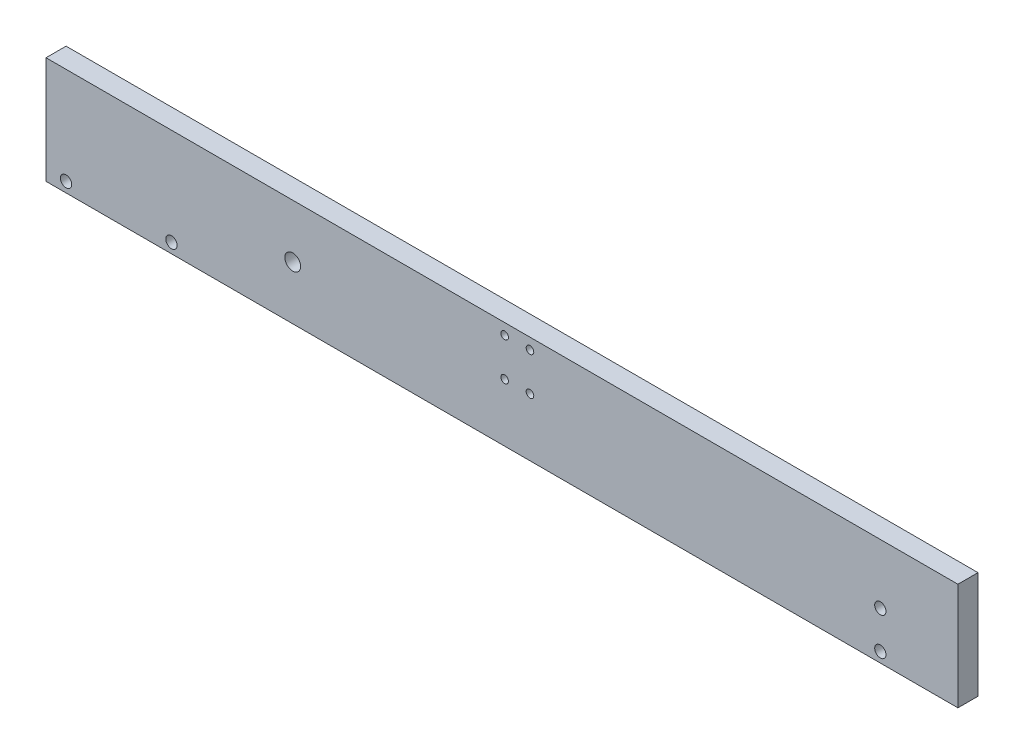
ISO-10303-21;
HEADER;
FILE_DESCRIPTION(('STEP AP214'),'2;1');
FILE_NAME('part.step','',(''),(''),'','','');
FILE_SCHEMA(('AUTOMOTIVE_DESIGN { 1 0 10303 214 1 1 1 1 }'));
ENDSEC;
DATA;
#1=APPLICATION_CONTEXT('core data for automotive mechanical design processes');
#2=APPLICATION_PROTOCOL_DEFINITION('international standard','automotive_design',2000,#1);
#3=PRODUCT_CONTEXT('',#1,'mechanical');
#4=PRODUCT('Part','Part','',(#3));
#5=PRODUCT_RELATED_PRODUCT_CATEGORY('part','',(#4));
#6=PRODUCT_DEFINITION_FORMATION('','',#4);
#7=PRODUCT_DEFINITION_CONTEXT('part definition',#1,'design');
#8=PRODUCT_DEFINITION('design','',#6,#7);
#9=PRODUCT_DEFINITION_SHAPE('','',#8);
#10=(LENGTH_UNIT() NAMED_UNIT(*) SI_UNIT(.MILLI.,.METRE.));
#11=(NAMED_UNIT(*) PLANE_ANGLE_UNIT() SI_UNIT($,.RADIAN.));
#12=(NAMED_UNIT(*) SI_UNIT($,.STERADIAN.) SOLID_ANGLE_UNIT());
#13=UNCERTAINTY_MEASURE_WITH_UNIT(LENGTH_MEASURE(1.E-05),#10,'distance_accuracy_value','');
#14=(GEOMETRIC_REPRESENTATION_CONTEXT(3) GLOBAL_UNCERTAINTY_ASSIGNED_CONTEXT((#13)) GLOBAL_UNIT_ASSIGNED_CONTEXT((#10,
#11,#12)) REPRESENTATION_CONTEXT('',''));
#15=CARTESIAN_POINT('',(0.,0.,0.));
#16=DIRECTION('',(0.,0.,1.));
#17=DIRECTION('',(1.,0.,0.));
#18=AXIS2_PLACEMENT_3D('',#15,#16,#17);
#19=CARTESIAN_POINT('',(0.,0.,6.35));
#20=DIRECTION('',(0.,0.,1.));
#21=DIRECTION('',(1.,0.,0.));
#22=AXIS2_PLACEMENT_3D('',#19,#20,#21);
#23=PLANE('',#22);
#24=CARTESIAN_POINT('',(-24.525,15.025,6.35));
#25=DIRECTION('',(0.,0.,1.));
#26=DIRECTION('',(1.,0.,0.));
#27=AXIS2_PLACEMENT_3D('',#24,#25,#26);
#28=CIRCLE('',#27,1.78593749999999);
#29=CARTESIAN_POINT('',(-22.7390625,15.025,6.35));
#30=VERTEX_POINT('',#29);
#31=EDGE_CURVE('E182',#30,#30,#28,.T.);
#32=ORIENTED_EDGE('',*,*,#31,.F.);
#33=EDGE_LOOP('',(#32));
#34=FACE_BOUND('',#33,.T.);
#35=CARTESIAN_POINT('',(-248.64,3.17500000000001,6.35));
#36=DIRECTION('',(0.,0.,1.));
#37=DIRECTION('',(1.,0.,0.));
#38=AXIS2_PLACEMENT_3D('',#35,#36,#37);
#39=CIRCLE('',#38,1.78593750000002);
#40=CARTESIAN_POINT('',(-246.8540625,3.17500000000001,6.35));
#41=VERTEX_POINT('',#40);
#42=EDGE_CURVE('E166',#41,#41,#39,.T.);
#43=ORIENTED_EDGE('',*,*,#42,.F.);
#44=EDGE_LOOP('',(#43));
#45=FACE_BOUND('',#44,.T.);
#46=CARTESIAN_POINT('',(-143.29,18.35,6.35));
#47=DIRECTION('',(0.,0.,1.));
#48=DIRECTION('',(1.,0.,0.));
#49=AXIS2_PLACEMENT_3D('',#46,#47,#48);
#50=CIRCLE('',#49,1.20000000000004);
#51=CARTESIAN_POINT('',(-142.09,18.35,6.35));
#52=VERTEX_POINT('',#51);
#53=EDGE_CURVE('E150',#52,#52,#50,.T.);
#54=ORIENTED_EDGE('',*,*,#53,.F.);
#55=EDGE_LOOP('',(#54));
#56=FACE_BOUND('',#55,.T.);
#57=CARTESIAN_POINT('',(-135.29,18.35,6.35));
#58=DIRECTION('',(0.,0.,1.));
#59=DIRECTION('',(1.,0.,0.));
#60=AXIS2_PLACEMENT_3D('',#57,#58,#59);
#61=CIRCLE('',#60,1.20000000000002);
#62=CARTESIAN_POINT('',(-134.09,18.35,6.35));
#63=VERTEX_POINT('',#62);
#64=EDGE_CURVE('E134',#63,#63,#61,.T.);
#65=ORIENTED_EDGE('',*,*,#64,.F.);
#66=EDGE_LOOP('',(#65));
#67=FACE_BOUND('',#66,.T.);
#68=DIRECTION('',(0.,1.,0.));
#69=VECTOR('',#68,1.);
#70=CARTESIAN_POINT('',(0.,0.,6.35));
#71=LINE('',#70,#69);
#72=CARTESIAN_POINT('',(0.,0.,6.35));
#73=VERTEX_POINT('',#72);
#74=CARTESIAN_POINT('',(0.,33.85,6.35));
#75=VERTEX_POINT('',#74);
#76=EDGE_CURVE('E92',#73,#75,#71,.T.);
#77=ORIENTED_EDGE('',*,*,#76,.T.);
#78=DIRECTION('',(-1.,0.,0.));
#79=VECTOR('',#78,1.);
#80=CARTESIAN_POINT('',(0.,33.85,6.35));
#81=LINE('',#80,#79);
#82=CARTESIAN_POINT('',(-288.29,33.85,6.35));
#83=VERTEX_POINT('',#82);
#84=EDGE_CURVE('E87',#75,#83,#81,.T.);
#85=ORIENTED_EDGE('',*,*,#84,.T.);
#86=DIRECTION('',(0.,-1.,0.));
#87=VECTOR('',#86,1.);
#88=CARTESIAN_POINT('',(-288.29,33.85,6.35));
#89=LINE('',#88,#87);
#90=CARTESIAN_POINT('',(-288.29,0.,6.35));
#91=VERTEX_POINT('',#90);
#92=EDGE_CURVE('E90',#83,#91,#89,.T.);
#93=ORIENTED_EDGE('',*,*,#92,.T.);
#94=DIRECTION('',(1.,0.,0.));
#95=VECTOR('',#94,1.);
#96=CARTESIAN_POINT('',(0.,0.,6.35));
#97=LINE('',#96,#95);
#98=EDGE_CURVE('E57',#91,#73,#97,.T.);
#99=ORIENTED_EDGE('',*,*,#98,.T.);
#100=EDGE_LOOP('',(#77,#85,#93,#99));
#101=FACE_BOUND('',#100,.T.);
#102=CARTESIAN_POINT('',(-210.29,16.925,6.35));
#103=DIRECTION('',(0.,0.,1.));
#104=DIRECTION('',(1.,0.,0.));
#105=AXIS2_PLACEMENT_3D('',#102,#103,#104);
#106=CIRCLE('',#105,2.49999999999999);
#107=CARTESIAN_POINT('',(-207.79,16.925,6.35));
#108=VERTEX_POINT('',#107);
#109=EDGE_CURVE('E112',#108,#108,#106,.T.);
#110=ORIENTED_EDGE('',*,*,#109,.F.);
#111=EDGE_LOOP('',(#110));
#112=FACE_BOUND('',#111,.T.);
#113=CARTESIAN_POINT('',(-135.29,30.35,6.35));
#114=DIRECTION('',(0.,0.,1.));
#115=DIRECTION('',(1.,0.,0.));
#116=AXIS2_PLACEMENT_3D('',#113,#114,#115);
#117=CIRCLE('',#116,1.20000000000002);
#118=CARTESIAN_POINT('',(-134.09,30.35,6.35));
#119=VERTEX_POINT('',#118);
#120=EDGE_CURVE('E142',#119,#119,#117,.T.);
#121=ORIENTED_EDGE('',*,*,#120,.F.);
#122=EDGE_LOOP('',(#121));
#123=FACE_BOUND('',#122,.T.);
#124=CARTESIAN_POINT('',(-143.29,30.35,6.35));
#125=DIRECTION('',(0.,0.,1.));
#126=DIRECTION('',(1.,0.,0.));
#127=AXIS2_PLACEMENT_3D('',#124,#125,#126);
#128=CIRCLE('',#127,1.20000000000004);
#129=CARTESIAN_POINT('',(-142.09,30.35,6.35));
#130=VERTEX_POINT('',#129);
#131=EDGE_CURVE('E158',#130,#130,#128,.T.);
#132=ORIENTED_EDGE('',*,*,#131,.F.);
#133=EDGE_LOOP('',(#132));
#134=FACE_BOUND('',#133,.T.);
#135=CARTESIAN_POINT('',(-281.94,3.17500000000001,6.35));
#136=DIRECTION('',(0.,0.,1.));
#137=DIRECTION('',(1.,0.,0.));
#138=AXIS2_PLACEMENT_3D('',#135,#136,#137);
#139=CIRCLE('',#138,1.78593749999999);
#140=CARTESIAN_POINT('',(-280.1540625,3.17500000000001,6.35));
#141=VERTEX_POINT('',#140);
#142=EDGE_CURVE('E174',#141,#141,#139,.T.);
#143=ORIENTED_EDGE('',*,*,#142,.F.);
#144=EDGE_LOOP('',(#143));
#145=FACE_BOUND('',#144,.T.);
#146=CARTESIAN_POINT('',(-24.525,3.17499999999999,6.35));
#147=DIRECTION('',(0.,0.,1.));
#148=DIRECTION('',(1.,0.,0.));
#149=AXIS2_PLACEMENT_3D('',#146,#147,#148);
#150=CIRCLE('',#149,1.78593749999999);
#151=CARTESIAN_POINT('',(-22.7390625,3.17499999999999,6.35));
#152=VERTEX_POINT('',#151);
#153=EDGE_CURVE('E190',#152,#152,#150,.T.);
#154=ORIENTED_EDGE('',*,*,#153,.F.);
#155=EDGE_LOOP('',(#154));
#156=FACE_BOUND('',#155,.T.);
#157=ADVANCED_FACE('F39',(#34,#45,#56,#67,#101,#112,#123,#134,#145,#156),#23,.T.);
#158=CARTESIAN_POINT('',(0.,0.,0.));
#159=DIRECTION('',(0.,0.,1.));
#160=DIRECTION('',(1.,0.,0.));
#161=AXIS2_PLACEMENT_3D('',#158,#159,#160);
#162=PLANE('',#161);
#163=DIRECTION('',(0.,1.,0.));
#164=VECTOR('',#163,1.);
#165=CARTESIAN_POINT('',(0.,0.,0.));
#166=LINE('',#165,#164);
#167=CARTESIAN_POINT('',(0.,0.,0.));
#168=VERTEX_POINT('',#167);
#169=CARTESIAN_POINT('',(0.,33.85,0.));
#170=VERTEX_POINT('',#169);
#171=EDGE_CURVE('E108',#168,#170,#166,.T.);
#172=ORIENTED_EDGE('',*,*,#171,.F.);
#173=DIRECTION('',(1.,0.,0.));
#174=VECTOR('',#173,1.);
#175=CARTESIAN_POINT('',(0.,0.,0.));
#176=LINE('',#175,#174);
#177=CARTESIAN_POINT('',(-288.29,0.,0.));
#178=VERTEX_POINT('',#177);
#179=EDGE_CURVE('E80',#178,#168,#176,.T.);
#180=ORIENTED_EDGE('',*,*,#179,.F.);
#181=DIRECTION('',(0.,-1.,0.));
#182=VECTOR('',#181,1.);
#183=CARTESIAN_POINT('',(-288.29,33.85,0.));
#184=LINE('',#183,#182);
#185=CARTESIAN_POINT('',(-288.29,33.85,0.));
#186=VERTEX_POINT('',#185);
#187=EDGE_CURVE('E74',#186,#178,#184,.T.);
#188=ORIENTED_EDGE('',*,*,#187,.F.);
#189=DIRECTION('',(-1.,0.,0.));
#190=VECTOR('',#189,1.);
#191=CARTESIAN_POINT('',(0.,33.85,0.));
#192=LINE('',#191,#190);
#193=EDGE_CURVE('E97',#170,#186,#192,.T.);
#194=ORIENTED_EDGE('',*,*,#193,.F.);
#195=EDGE_LOOP('',(#172,#180,#188,#194));
#196=FACE_BOUND('',#195,.T.);
#197=CARTESIAN_POINT('',(-210.29,16.925,0.));
#198=DIRECTION('',(0.,0.,1.));
#199=DIRECTION('',(1.,0.,0.));
#200=AXIS2_PLACEMENT_3D('',#197,#198,#199);
#201=CIRCLE('',#200,2.49999999999999);
#202=CARTESIAN_POINT('',(-207.79,16.925,0.));
#203=VERTEX_POINT('',#202);
#204=EDGE_CURVE('E130',#203,#203,#201,.T.);
#205=ORIENTED_EDGE('',*,*,#204,.T.);
#206=EDGE_LOOP('',(#205));
#207=FACE_BOUND('',#206,.T.);
#208=CARTESIAN_POINT('',(-135.29,18.35,0.));
#209=DIRECTION('',(0.,0.,1.));
#210=DIRECTION('',(1.,0.,0.));
#211=AXIS2_PLACEMENT_3D('',#208,#209,#210);
#212=CIRCLE('',#211,1.20000000000002);
#213=CARTESIAN_POINT('',(-134.09,18.35,0.));
#214=VERTEX_POINT('',#213);
#215=EDGE_CURVE('E138',#214,#214,#212,.T.);
#216=ORIENTED_EDGE('',*,*,#215,.T.);
#217=EDGE_LOOP('',(#216));
#218=FACE_BOUND('',#217,.T.);
#219=CARTESIAN_POINT('',(-135.29,30.35,0.));
#220=DIRECTION('',(0.,0.,1.));
#221=DIRECTION('',(1.,0.,0.));
#222=AXIS2_PLACEMENT_3D('',#219,#220,#221);
#223=CIRCLE('',#222,1.20000000000002);
#224=CARTESIAN_POINT('',(-134.09,30.35,0.));
#225=VERTEX_POINT('',#224);
#226=EDGE_CURVE('E146',#225,#225,#223,.T.);
#227=ORIENTED_EDGE('',*,*,#226,.T.);
#228=EDGE_LOOP('',(#227));
#229=FACE_BOUND('',#228,.T.);
#230=CARTESIAN_POINT('',(-143.29,18.35,0.));
#231=DIRECTION('',(0.,0.,1.));
#232=DIRECTION('',(1.,0.,0.));
#233=AXIS2_PLACEMENT_3D('',#230,#231,#232);
#234=CIRCLE('',#233,1.20000000000004);
#235=CARTESIAN_POINT('',(-142.09,18.35,0.));
#236=VERTEX_POINT('',#235);
#237=EDGE_CURVE('E154',#236,#236,#234,.T.);
#238=ORIENTED_EDGE('',*,*,#237,.T.);
#239=EDGE_LOOP('',(#238));
#240=FACE_BOUND('',#239,.T.);
#241=CARTESIAN_POINT('',(-143.29,30.35,0.));
#242=DIRECTION('',(0.,0.,1.));
#243=DIRECTION('',(1.,0.,0.));
#244=AXIS2_PLACEMENT_3D('',#241,#242,#243);
#245=CIRCLE('',#244,1.20000000000004);
#246=CARTESIAN_POINT('',(-142.09,30.35,0.));
#247=VERTEX_POINT('',#246);
#248=EDGE_CURVE('E162',#247,#247,#245,.T.);
#249=ORIENTED_EDGE('',*,*,#248,.T.);
#250=EDGE_LOOP('',(#249));
#251=FACE_BOUND('',#250,.T.);
#252=CARTESIAN_POINT('',(-248.64,3.17500000000001,0.));
#253=DIRECTION('',(0.,0.,1.));
#254=DIRECTION('',(1.,0.,0.));
#255=AXIS2_PLACEMENT_3D('',#252,#253,#254);
#256=CIRCLE('',#255,1.78593750000002);
#257=CARTESIAN_POINT('',(-246.8540625,3.17500000000001,0.));
#258=VERTEX_POINT('',#257);
#259=EDGE_CURVE('E170',#258,#258,#256,.T.);
#260=ORIENTED_EDGE('',*,*,#259,.T.);
#261=EDGE_LOOP('',(#260));
#262=FACE_BOUND('',#261,.T.);
#263=CARTESIAN_POINT('',(-281.94,3.17500000000001,0.));
#264=DIRECTION('',(0.,0.,1.));
#265=DIRECTION('',(1.,0.,0.));
#266=AXIS2_PLACEMENT_3D('',#263,#264,#265);
#267=CIRCLE('',#266,1.78593749999999);
#268=CARTESIAN_POINT('',(-280.1540625,3.17500000000001,0.));
#269=VERTEX_POINT('',#268);
#270=EDGE_CURVE('E178',#269,#269,#267,.T.);
#271=ORIENTED_EDGE('',*,*,#270,.T.);
#272=EDGE_LOOP('',(#271));
#273=FACE_BOUND('',#272,.T.);
#274=CARTESIAN_POINT('',(-24.525,15.025,0.));
#275=DIRECTION('',(0.,0.,1.));
#276=DIRECTION('',(1.,0.,0.));
#277=AXIS2_PLACEMENT_3D('',#274,#275,#276);
#278=CIRCLE('',#277,1.78593749999999);
#279=CARTESIAN_POINT('',(-22.7390625,15.025,0.));
#280=VERTEX_POINT('',#279);
#281=EDGE_CURVE('E186',#280,#280,#278,.T.);
#282=ORIENTED_EDGE('',*,*,#281,.T.);
#283=EDGE_LOOP('',(#282));
#284=FACE_BOUND('',#283,.T.);
#285=CARTESIAN_POINT('',(-24.525,3.17499999999999,0.));
#286=DIRECTION('',(0.,0.,1.));
#287=DIRECTION('',(1.,0.,0.));
#288=AXIS2_PLACEMENT_3D('',#285,#286,#287);
#289=CIRCLE('',#288,1.78593749999999);
#290=CARTESIAN_POINT('',(-22.7390625,3.17499999999999,0.));
#291=VERTEX_POINT('',#290);
#292=EDGE_CURVE('E194',#291,#291,#289,.T.);
#293=ORIENTED_EDGE('',*,*,#292,.T.);
#294=EDGE_LOOP('',(#293));
#295=FACE_BOUND('',#294,.T.);
#296=ADVANCED_FACE('F125',(#196,#207,#218,#229,#240,#251,#262,#273,#284,#295),#162,.F.);
#297=CARTESIAN_POINT('',(0.,0.,6.35));
#298=DIRECTION('',(-1.,0.,0.));
#299=DIRECTION('',(0.,0.,1.));
#300=AXIS2_PLACEMENT_3D('',#297,#298,#299);
#301=PLANE('',#300);
#302=ORIENTED_EDGE('',*,*,#171,.T.);
#303=DIRECTION('',(0.,0.,-1.));
#304=VECTOR('',#303,1.);
#305=CARTESIAN_POINT('',(0.,33.85,6.35));
#306=LINE('',#305,#304);
#307=EDGE_CURVE('E11',#75,#170,#306,.T.);
#308=ORIENTED_EDGE('',*,*,#307,.F.);
#309=ORIENTED_EDGE('',*,*,#76,.F.);
#310=DIRECTION('',(0.,0.,-1.));
#311=VECTOR('',#310,1.);
#312=CARTESIAN_POINT('',(0.,0.,6.35));
#313=LINE('',#312,#311);
#314=EDGE_CURVE('E104',#73,#168,#313,.T.);
#315=ORIENTED_EDGE('',*,*,#314,.T.);
#316=EDGE_LOOP('',(#302,#308,#309,#315));
#317=FACE_BOUND('',#316,.T.);
#318=ADVANCED_FACE('F41',(#317),#301,.F.);
#319=CARTESIAN_POINT('',(0.,33.85,6.35));
#320=DIRECTION('',(0.,-1.,0.));
#321=DIRECTION('',(0.,0.,-1.));
#322=AXIS2_PLACEMENT_3D('',#319,#320,#321);
#323=PLANE('',#322);
#324=ORIENTED_EDGE('',*,*,#193,.T.);
#325=DIRECTION('',(0.,0.,-1.));
#326=VECTOR('',#325,1.);
#327=CARTESIAN_POINT('',(-288.29,33.85,6.35));
#328=LINE('',#327,#326);
#329=EDGE_CURVE('E49',#83,#186,#328,.T.);
#330=ORIENTED_EDGE('',*,*,#329,.F.);
#331=ORIENTED_EDGE('',*,*,#84,.F.);
#332=ORIENTED_EDGE('',*,*,#307,.T.);
#333=EDGE_LOOP('',(#324,#330,#331,#332));
#334=FACE_BOUND('',#333,.T.);
#335=ADVANCED_FACE('F96',(#334),#323,.F.);
#336=CARTESIAN_POINT('',(-288.29,33.85,6.35));
#337=DIRECTION('',(1.,0.,0.));
#338=DIRECTION('',(0.,0.,-1.));
#339=AXIS2_PLACEMENT_3D('',#336,#337,#338);
#340=PLANE('',#339);
#341=ORIENTED_EDGE('',*,*,#187,.T.);
#342=DIRECTION('',(0.,0.,-1.));
#343=VECTOR('',#342,1.);
#344=CARTESIAN_POINT('',(-288.29,0.,6.35));
#345=LINE('',#344,#343);
#346=EDGE_CURVE('E99',#91,#178,#345,.T.);
#347=ORIENTED_EDGE('',*,*,#346,.F.);
#348=ORIENTED_EDGE('',*,*,#92,.F.);
#349=ORIENTED_EDGE('',*,*,#329,.T.);
#350=EDGE_LOOP('',(#341,#347,#348,#349));
#351=FACE_BOUND('',#350,.T.);
#352=ADVANCED_FACE('F100',(#351),#340,.F.);
#353=CARTESIAN_POINT('',(0.,0.,6.35));
#354=DIRECTION('',(0.,1.,0.));
#355=DIRECTION('',(-1.,0.,0.));
#356=AXIS2_PLACEMENT_3D('',#353,#354,#355);
#357=PLANE('',#356);
#358=ORIENTED_EDGE('',*,*,#179,.T.);
#359=ORIENTED_EDGE('',*,*,#314,.F.);
#360=ORIENTED_EDGE('',*,*,#98,.F.);
#361=ORIENTED_EDGE('',*,*,#346,.T.);
#362=EDGE_LOOP('',(#358,#359,#360,#361));
#363=FACE_BOUND('',#362,.T.);
#364=ADVANCED_FACE('F122',(#363),#357,.F.);
#365=CARTESIAN_POINT('',(-210.29,16.925,6.35));
#366=DIRECTION('',(0.,0.,-1.));
#367=DIRECTION('',(-1.,0.,0.));
#368=AXIS2_PLACEMENT_3D('',#365,#366,#367);
#369=CYLINDRICAL_SURFACE('',#368,2.49999999999999);
#370=ORIENTED_EDGE('',*,*,#109,.T.);
#371=EDGE_LOOP('',(#370));
#372=FACE_BOUND('',#371,.T.);
#373=ORIENTED_EDGE('',*,*,#204,.F.);
#374=EDGE_LOOP('',(#373));
#375=FACE_BOUND('',#374,.T.);
#376=ADVANCED_FACE('F215',(#372,#375),#369,.F.);
#377=CARTESIAN_POINT('',(-135.29,18.35,6.35));
#378=DIRECTION('',(0.,0.,-1.));
#379=DIRECTION('',(-1.,0.,0.));
#380=AXIS2_PLACEMENT_3D('',#377,#378,#379);
#381=CYLINDRICAL_SURFACE('',#380,1.20000000000002);
#382=ORIENTED_EDGE('',*,*,#64,.T.);
#383=EDGE_LOOP('',(#382));
#384=FACE_BOUND('',#383,.T.);
#385=ORIENTED_EDGE('',*,*,#215,.F.);
#386=EDGE_LOOP('',(#385));
#387=FACE_BOUND('',#386,.T.);
#388=ADVANCED_FACE('F261',(#384,#387),#381,.F.);
#389=CARTESIAN_POINT('',(-135.29,30.35,6.35));
#390=DIRECTION('',(0.,0.,-1.));
#391=DIRECTION('',(-1.,0.,0.));
#392=AXIS2_PLACEMENT_3D('',#389,#390,#391);
#393=CYLINDRICAL_SURFACE('',#392,1.20000000000002);
#394=ORIENTED_EDGE('',*,*,#120,.T.);
#395=EDGE_LOOP('',(#394));
#396=FACE_BOUND('',#395,.T.);
#397=ORIENTED_EDGE('',*,*,#226,.F.);
#398=EDGE_LOOP('',(#397));
#399=FACE_BOUND('',#398,.T.);
#400=ADVANCED_FACE('F269',(#396,#399),#393,.F.);
#401=CARTESIAN_POINT('',(-143.29,18.35,6.35));
#402=DIRECTION('',(0.,0.,-1.));
#403=DIRECTION('',(-1.,0.,0.));
#404=AXIS2_PLACEMENT_3D('',#401,#402,#403);
#405=CYLINDRICAL_SURFACE('',#404,1.20000000000004);
#406=ORIENTED_EDGE('',*,*,#53,.T.);
#407=EDGE_LOOP('',(#406));
#408=FACE_BOUND('',#407,.T.);
#409=ORIENTED_EDGE('',*,*,#237,.F.);
#410=EDGE_LOOP('',(#409));
#411=FACE_BOUND('',#410,.T.);
#412=ADVANCED_FACE('F277',(#408,#411),#405,.F.);
#413=CARTESIAN_POINT('',(-143.29,30.35,6.35));
#414=DIRECTION('',(0.,0.,-1.));
#415=DIRECTION('',(-1.,0.,0.));
#416=AXIS2_PLACEMENT_3D('',#413,#414,#415);
#417=CYLINDRICAL_SURFACE('',#416,1.20000000000004);
#418=ORIENTED_EDGE('',*,*,#131,.T.);
#419=EDGE_LOOP('',(#418));
#420=FACE_BOUND('',#419,.T.);
#421=ORIENTED_EDGE('',*,*,#248,.F.);
#422=EDGE_LOOP('',(#421));
#423=FACE_BOUND('',#422,.T.);
#424=ADVANCED_FACE('F286',(#420,#423),#417,.F.);
#425=CARTESIAN_POINT('',(-248.64,3.17500000000001,6.35));
#426=DIRECTION('',(0.,0.,-1.));
#427=DIRECTION('',(-1.,0.,0.));
#428=AXIS2_PLACEMENT_3D('',#425,#426,#427);
#429=CYLINDRICAL_SURFACE('',#428,1.78593750000002);
#430=ORIENTED_EDGE('',*,*,#42,.T.);
#431=EDGE_LOOP('',(#430));
#432=FACE_BOUND('',#431,.T.);
#433=ORIENTED_EDGE('',*,*,#259,.F.);
#434=EDGE_LOOP('',(#433));
#435=FACE_BOUND('',#434,.T.);
#436=ADVANCED_FACE('F295',(#432,#435),#429,.F.);
#437=CARTESIAN_POINT('',(-281.94,3.17500000000001,6.35));
#438=DIRECTION('',(0.,0.,-1.));
#439=DIRECTION('',(-1.,0.,0.));
#440=AXIS2_PLACEMENT_3D('',#437,#438,#439);
#441=CYLINDRICAL_SURFACE('',#440,1.78593749999999);
#442=ORIENTED_EDGE('',*,*,#142,.T.);
#443=EDGE_LOOP('',(#442));
#444=FACE_BOUND('',#443,.T.);
#445=ORIENTED_EDGE('',*,*,#270,.F.);
#446=EDGE_LOOP('',(#445));
#447=FACE_BOUND('',#446,.T.);
#448=ADVANCED_FACE('F304',(#444,#447),#441,.F.);
#449=CARTESIAN_POINT('',(-24.525,15.025,6.35));
#450=DIRECTION('',(0.,0.,-1.));
#451=DIRECTION('',(-1.,0.,0.));
#452=AXIS2_PLACEMENT_3D('',#449,#450,#451);
#453=CYLINDRICAL_SURFACE('',#452,1.78593749999999);
#454=ORIENTED_EDGE('',*,*,#31,.T.);
#455=EDGE_LOOP('',(#454));
#456=FACE_BOUND('',#455,.T.);
#457=ORIENTED_EDGE('',*,*,#281,.F.);
#458=EDGE_LOOP('',(#457));
#459=FACE_BOUND('',#458,.T.);
#460=ADVANCED_FACE('F313',(#456,#459),#453,.F.);
#461=CARTESIAN_POINT('',(-24.525,3.17499999999999,6.35));
#462=DIRECTION('',(0.,0.,-1.));
#463=DIRECTION('',(-1.,0.,0.));
#464=AXIS2_PLACEMENT_3D('',#461,#462,#463);
#465=CYLINDRICAL_SURFACE('',#464,1.78593749999999);
#466=ORIENTED_EDGE('',*,*,#153,.T.);
#467=EDGE_LOOP('',(#466));
#468=FACE_BOUND('',#467,.T.);
#469=ORIENTED_EDGE('',*,*,#292,.F.);
#470=EDGE_LOOP('',(#469));
#471=FACE_BOUND('',#470,.T.);
#472=ADVANCED_FACE('F202',(#468,#471),#465,.F.);
#473=CLOSED_SHELL('',(#157,#296,#318,#335,#352,#364,#376,#388,#400,#412,#424,#436,#448,#460,#472));
#474=MANIFOLD_SOLID_BREP('B2',#473);
#475=ADVANCED_BREP_SHAPE_REPRESENTATION('',(#18,#474),#14);
#476=SHAPE_DEFINITION_REPRESENTATION(#9,#475);
ENDSEC;
END-ISO-10303-21;
